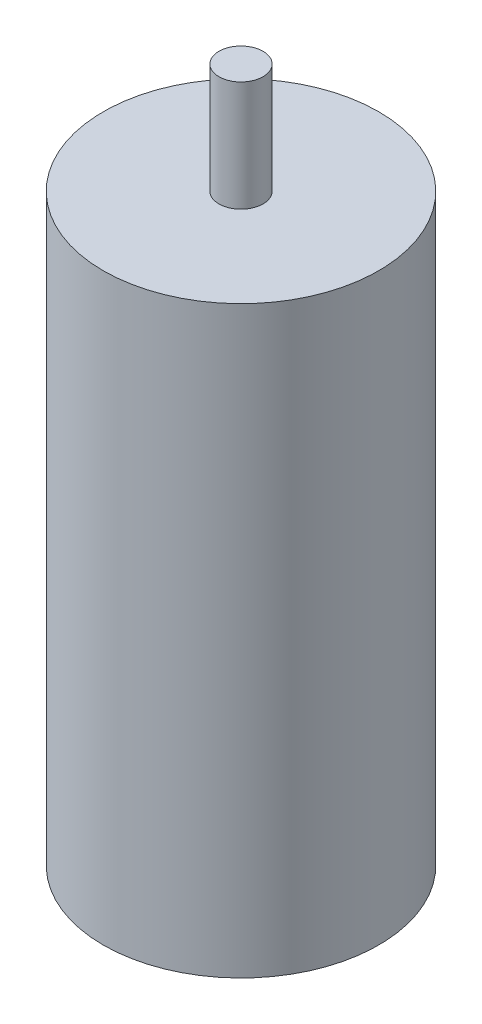
ISO-10303-21;
HEADER;
FILE_DESCRIPTION(('STEP AP214'),'2;1');
FILE_NAME('part.step','',(''),(''),'','','');
FILE_SCHEMA(('AUTOMOTIVE_DESIGN { 1 0 10303 214 1 1 1 1 }'));
ENDSEC;
DATA;
#1=APPLICATION_CONTEXT('core data for automotive mechanical design processes');
#2=APPLICATION_PROTOCOL_DEFINITION('international standard','automotive_design',2000,#1);
#3=PRODUCT_CONTEXT('',#1,'mechanical');
#4=PRODUCT('Part','Part','',(#3));
#5=PRODUCT_RELATED_PRODUCT_CATEGORY('part','',(#4));
#6=PRODUCT_DEFINITION_FORMATION('','',#4);
#7=PRODUCT_DEFINITION_CONTEXT('part definition',#1,'design');
#8=PRODUCT_DEFINITION('design','',#6,#7);
#9=PRODUCT_DEFINITION_SHAPE('','',#8);
#10=(LENGTH_UNIT() NAMED_UNIT(*) SI_UNIT(.MILLI.,.METRE.));
#11=(NAMED_UNIT(*) PLANE_ANGLE_UNIT() SI_UNIT($,.RADIAN.));
#12=(NAMED_UNIT(*) SI_UNIT($,.STERADIAN.) SOLID_ANGLE_UNIT());
#13=UNCERTAINTY_MEASURE_WITH_UNIT(LENGTH_MEASURE(1.E-05),#10,'distance_accuracy_value','');
#14=(GEOMETRIC_REPRESENTATION_CONTEXT(3) GLOBAL_UNCERTAINTY_ASSIGNED_CONTEXT((#13)) GLOBAL_UNIT_ASSIGNED_CONTEXT((#10,
#11,#12)) REPRESENTATION_CONTEXT('',''));
#15=CARTESIAN_POINT('',(0.,0.,0.));
#16=DIRECTION('',(0.,0.,1.));
#17=DIRECTION('',(1.,0.,0.));
#18=AXIS2_PLACEMENT_3D('',#15,#16,#17);
#19=CARTESIAN_POINT('',(0.,53.,0.));
#20=DIRECTION('',(0.,-1.,0.));
#21=DIRECTION('',(0.,0.,-1.));
#22=AXIS2_PLACEMENT_3D('',#19,#20,#21);
#23=CYLINDRICAL_SURFACE('',#22,12.5);
#24=CARTESIAN_POINT('',(0.,53.,0.));
#25=DIRECTION('',(0.,1.,0.));
#26=DIRECTION('',(0.,0.,1.));
#27=AXIS2_PLACEMENT_3D('',#24,#25,#26);
#28=CIRCLE('',#27,12.5);
#29=CARTESIAN_POINT('',(0.,53.,12.5));
#30=VERTEX_POINT('',#29);
#31=EDGE_CURVE('E40',#30,#30,#28,.T.);
#32=ORIENTED_EDGE('',*,*,#31,.F.);
#33=EDGE_LOOP('',(#32));
#34=FACE_BOUND('',#33,.T.);
#35=CARTESIAN_POINT('',(0.,0.,0.));
#36=DIRECTION('',(0.,1.,0.));
#37=DIRECTION('',(0.,0.,1.));
#38=AXIS2_PLACEMENT_3D('',#35,#36,#37);
#39=CIRCLE('',#38,12.5);
#40=CARTESIAN_POINT('',(0.,0.,12.5));
#41=VERTEX_POINT('',#40);
#42=EDGE_CURVE('E36',#41,#41,#39,.T.);
#43=ORIENTED_EDGE('',*,*,#42,.T.);
#44=EDGE_LOOP('',(#43));
#45=FACE_BOUND('',#44,.T.);
#46=ADVANCED_FACE('F33',(#34,#45),#23,.T.);
#47=CARTESIAN_POINT('',(0.,53.,0.));
#48=DIRECTION('',(0.,1.,0.));
#49=DIRECTION('',(0.,0.,1.));
#50=AXIS2_PLACEMENT_3D('',#47,#48,#49);
#51=PLANE('',#50);
#52=CARTESIAN_POINT('',(0.,53.,0.));
#53=DIRECTION('',(0.,1.,0.));
#54=DIRECTION('',(0.,0.,1.));
#55=AXIS2_PLACEMENT_3D('',#52,#53,#54);
#56=CIRCLE('',#55,2.);
#57=CARTESIAN_POINT('',(0.,53.,2.));
#58=VERTEX_POINT('',#57);
#59=EDGE_CURVE('E10',#58,#58,#56,.T.);
#60=ORIENTED_EDGE('',*,*,#59,.F.);
#61=EDGE_LOOP('',(#60));
#62=FACE_BOUND('',#61,.T.);
#63=ORIENTED_EDGE('',*,*,#31,.T.);
#64=EDGE_LOOP('',(#63));
#65=FACE_BOUND('',#64,.T.);
#66=ADVANCED_FACE('F57',(#62,#65),#51,.T.);
#67=CARTESIAN_POINT('',(0.,0.,0.));
#68=DIRECTION('',(0.,1.,0.));
#69=DIRECTION('',(0.,0.,1.));
#70=AXIS2_PLACEMENT_3D('',#67,#68,#69);
#71=PLANE('',#70);
#72=ORIENTED_EDGE('',*,*,#42,.F.);
#73=EDGE_LOOP('',(#72));
#74=FACE_BOUND('',#73,.T.);
#75=ADVANCED_FACE('F54',(#74),#71,.F.);
#76=CARTESIAN_POINT('',(0.,63.,0.));
#77=DIRECTION('',(0.,-1.,0.));
#78=DIRECTION('',(0.,0.,-1.));
#79=AXIS2_PLACEMENT_3D('',#76,#77,#78);
#80=CYLINDRICAL_SURFACE('',#79,2.);
#81=CARTESIAN_POINT('',(0.,63.,0.));
#82=DIRECTION('',(0.,1.,0.));
#83=DIRECTION('',(0.,0.,1.));
#84=AXIS2_PLACEMENT_3D('',#81,#82,#83);
#85=CIRCLE('',#84,2.);
#86=CARTESIAN_POINT('',(0.,63.,2.));
#87=VERTEX_POINT('',#86);
#88=EDGE_CURVE('E46',#87,#87,#85,.T.);
#89=ORIENTED_EDGE('',*,*,#88,.F.);
#90=EDGE_LOOP('',(#89));
#91=FACE_BOUND('',#90,.T.);
#92=ORIENTED_EDGE('',*,*,#59,.T.);
#93=EDGE_LOOP('',(#92));
#94=FACE_BOUND('',#93,.T.);
#95=ADVANCED_FACE('F56',(#91,#94),#80,.T.);
#96=CARTESIAN_POINT('',(0.,63.,0.));
#97=DIRECTION('',(0.,1.,0.));
#98=DIRECTION('',(0.,0.,1.));
#99=AXIS2_PLACEMENT_3D('',#96,#97,#98);
#100=PLANE('',#99);
#101=ORIENTED_EDGE('',*,*,#88,.T.);
#102=EDGE_LOOP('',(#101));
#103=FACE_BOUND('',#102,.T.);
#104=ADVANCED_FACE('F62',(#103),#100,.T.);
#105=CLOSED_SHELL('',(#46,#66,#75,#95,#104));
#106=MANIFOLD_SOLID_BREP('B2',#105);
#107=ADVANCED_BREP_SHAPE_REPRESENTATION('',(#18,#106),#14);
#108=SHAPE_DEFINITION_REPRESENTATION(#9,#107);
ENDSEC;
END-ISO-10303-21;
